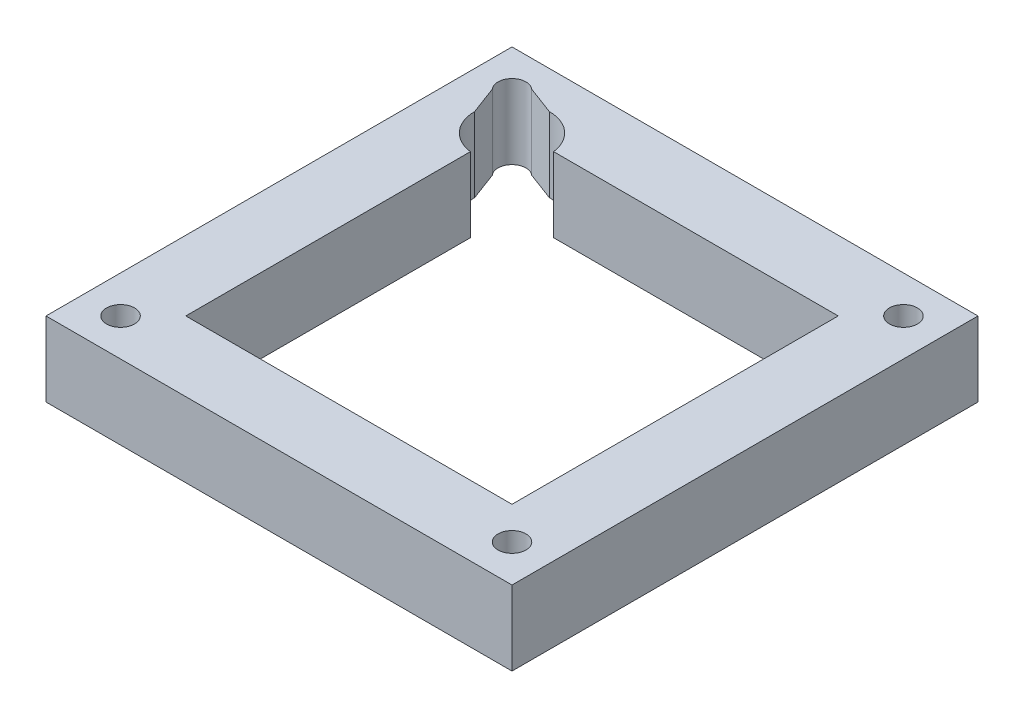
ISO-10303-21;
HEADER;
FILE_DESCRIPTION(('STEP AP214'),'2;1');
FILE_NAME('part.step','',(''),(''),'','','');
FILE_SCHEMA(('AUTOMOTIVE_DESIGN { 1 0 10303 214 1 1 1 1 }'));
ENDSEC;
DATA;
#1=APPLICATION_CONTEXT('core data for automotive mechanical design processes');
#2=APPLICATION_PROTOCOL_DEFINITION('international standard','automotive_design',2000,#1);
#3=PRODUCT_CONTEXT('',#1,'mechanical');
#4=PRODUCT('Part','Part','',(#3));
#5=PRODUCT_RELATED_PRODUCT_CATEGORY('part','',(#4));
#6=PRODUCT_DEFINITION_FORMATION('','',#4);
#7=PRODUCT_DEFINITION_CONTEXT('part definition',#1,'design');
#8=PRODUCT_DEFINITION('design','',#6,#7);
#9=PRODUCT_DEFINITION_SHAPE('','',#8);
#10=(LENGTH_UNIT() NAMED_UNIT(*) SI_UNIT(.MILLI.,.METRE.));
#11=(NAMED_UNIT(*) PLANE_ANGLE_UNIT() SI_UNIT($,.RADIAN.));
#12=(NAMED_UNIT(*) SI_UNIT($,.STERADIAN.) SOLID_ANGLE_UNIT());
#13=UNCERTAINTY_MEASURE_WITH_UNIT(LENGTH_MEASURE(1.E-05),#10,'distance_accuracy_value','');
#14=(GEOMETRIC_REPRESENTATION_CONTEXT(3) GLOBAL_UNCERTAINTY_ASSIGNED_CONTEXT((#13)) GLOBAL_UNIT_ASSIGNED_CONTEXT((#10,
#11,#12)) REPRESENTATION_CONTEXT('',''));
#15=CARTESIAN_POINT('',(0.,0.,0.));
#16=DIRECTION('',(0.,0.,1.));
#17=DIRECTION('',(1.,0.,0.));
#18=AXIS2_PLACEMENT_3D('',#15,#16,#17);
#19=CARTESIAN_POINT('',(0.,8.,25.));
#20=DIRECTION('',(0.,0.,-1.));
#21=DIRECTION('',(-1.,0.,0.));
#22=AXIS2_PLACEMENT_3D('',#19,#20,#21);
#23=PLANE('',#22);
#24=DIRECTION('',(1.,0.,0.));
#25=VECTOR('',#24,1.);
#26=CARTESIAN_POINT('',(0.,0.,25.));
#27=LINE('',#26,#25);
#28=CARTESIAN_POINT('',(-25.,0.,25.));
#29=VERTEX_POINT('',#28);
#30=CARTESIAN_POINT('',(25.,0.,25.));
#31=VERTEX_POINT('',#30);
#32=EDGE_CURVE('E226',#29,#31,#27,.T.);
#33=ORIENTED_EDGE('',*,*,#32,.T.);
#34=DIRECTION('',(0.,-1.,0.));
#35=VECTOR('',#34,1.);
#36=CARTESIAN_POINT('',(25.,8.,25.));
#37=LINE('',#36,#35);
#38=CARTESIAN_POINT('',(25.,8.,25.));
#39=VERTEX_POINT('',#38);
#40=EDGE_CURVE('E11',#39,#31,#37,.T.);
#41=ORIENTED_EDGE('',*,*,#40,.F.);
#42=DIRECTION('',(1.,0.,0.));
#43=VECTOR('',#42,1.);
#44=CARTESIAN_POINT('',(0.,8.,25.));
#45=LINE('',#44,#43);
#46=CARTESIAN_POINT('',(-25.,8.,25.));
#47=VERTEX_POINT('',#46);
#48=EDGE_CURVE('E160',#47,#39,#45,.T.);
#49=ORIENTED_EDGE('',*,*,#48,.F.);
#50=DIRECTION('',(0.,-1.,0.));
#51=VECTOR('',#50,1.);
#52=CARTESIAN_POINT('',(-25.,8.,25.));
#53=LINE('',#52,#51);
#54=EDGE_CURVE('E69',#47,#29,#53,.T.);
#55=ORIENTED_EDGE('',*,*,#54,.T.);
#56=EDGE_LOOP('',(#33,#41,#49,#55));
#57=FACE_BOUND('',#56,.T.);
#58=ADVANCED_FACE('F49',(#57),#23,.F.);
#59=CARTESIAN_POINT('',(25.,8.,0.));
#60=DIRECTION('',(-1.,0.,0.));
#61=DIRECTION('',(0.,0.,1.));
#62=AXIS2_PLACEMENT_3D('',#59,#60,#61);
#63=PLANE('',#62);
#64=DIRECTION('',(0.,0.,-1.));
#65=VECTOR('',#64,1.);
#66=CARTESIAN_POINT('',(25.,0.,0.));
#67=LINE('',#66,#65);
#68=CARTESIAN_POINT('',(25.,0.,-25.));
#69=VERTEX_POINT('',#68);
#70=EDGE_CURVE('E167',#31,#69,#67,.T.);
#71=ORIENTED_EDGE('',*,*,#70,.T.);
#72=DIRECTION('',(0.,-1.,0.));
#73=VECTOR('',#72,1.);
#74=CARTESIAN_POINT('',(25.,8.,-25.));
#75=LINE('',#74,#73);
#76=CARTESIAN_POINT('',(25.,8.,-25.));
#77=VERTEX_POINT('',#76);
#78=EDGE_CURVE('E60',#77,#69,#75,.T.);
#79=ORIENTED_EDGE('',*,*,#78,.F.);
#80=DIRECTION('',(0.,0.,-1.));
#81=VECTOR('',#80,1.);
#82=CARTESIAN_POINT('',(25.,8.,0.));
#83=LINE('',#82,#81);
#84=EDGE_CURVE('E153',#39,#77,#83,.T.);
#85=ORIENTED_EDGE('',*,*,#84,.F.);
#86=ORIENTED_EDGE('',*,*,#40,.T.);
#87=EDGE_LOOP('',(#71,#79,#85,#86));
#88=FACE_BOUND('',#87,.T.);
#89=ADVANCED_FACE('F166',(#88),#63,.F.);
#90=CARTESIAN_POINT('',(0.,8.,-25.));
#91=DIRECTION('',(0.,0.,-1.));
#92=DIRECTION('',(-1.,0.,0.));
#93=AXIS2_PLACEMENT_3D('',#90,#91,#92);
#94=PLANE('',#93);
#95=DIRECTION('',(1.,0.,0.));
#96=VECTOR('',#95,1.);
#97=CARTESIAN_POINT('',(0.,0.,-25.));
#98=LINE('',#97,#96);
#99=CARTESIAN_POINT('',(-25.,0.,-25.));
#100=VERTEX_POINT('',#99);
#101=EDGE_CURVE('E231',#100,#69,#98,.T.);
#102=ORIENTED_EDGE('',*,*,#101,.F.);
#103=DIRECTION('',(0.,-1.,0.));
#104=VECTOR('',#103,1.);
#105=CARTESIAN_POINT('',(-25.,8.,-25.));
#106=LINE('',#105,#104);
#107=CARTESIAN_POINT('',(-25.,8.,-25.));
#108=VERTEX_POINT('',#107);
#109=EDGE_CURVE('E110',#108,#100,#106,.T.);
#110=ORIENTED_EDGE('',*,*,#109,.F.);
#111=DIRECTION('',(1.,0.,0.));
#112=VECTOR('',#111,1.);
#113=CARTESIAN_POINT('',(0.,8.,-25.));
#114=LINE('',#113,#112);
#115=EDGE_CURVE('E159',#108,#77,#114,.T.);
#116=ORIENTED_EDGE('',*,*,#115,.T.);
#117=ORIENTED_EDGE('',*,*,#78,.T.);
#118=EDGE_LOOP('',(#102,#110,#116,#117));
#119=FACE_BOUND('',#118,.T.);
#120=ADVANCED_FACE('F172',(#119),#94,.T.);
#121=CARTESIAN_POINT('',(-17.,8.,-17.));
#122=DIRECTION('',(0.,-1.,0.));
#123=DIRECTION('',(0.,0.,-1.));
#124=AXIS2_PLACEMENT_3D('',#121,#122,#123);
#125=CYLINDRICAL_SURFACE('',#124,4.);
#126=CARTESIAN_POINT('',(-17.,0.,-17.));
#127=DIRECTION('',(0.,1.,0.));
#128=DIRECTION('',(0.,0.,1.));
#129=AXIS2_PLACEMENT_3D('',#126,#127,#128);
#130=CIRCLE('',#129,4.);
#131=CARTESIAN_POINT('',(-13.0313730334031,0.,-17.5));
#132=VERTEX_POINT('',#131);
#133=CARTESIAN_POINT('',(-17.,0.,-21.));
#134=VERTEX_POINT('',#133);
#135=EDGE_CURVE('E189',#132,#134,#130,.T.);
#136=ORIENTED_EDGE('',*,*,#135,.F.);
#137=DIRECTION('',(0.,-1.,0.));
#138=VECTOR('',#137,1.);
#139=CARTESIAN_POINT('',(-13.0313730334031,8.,-17.5));
#140=LINE('',#139,#138);
#141=CARTESIAN_POINT('',(-13.0313730334031,8.,-17.5));
#142=VERTEX_POINT('',#141);
#143=EDGE_CURVE('E53',#142,#132,#140,.T.);
#144=ORIENTED_EDGE('',*,*,#143,.F.);
#145=CARTESIAN_POINT('',(-17.,8.,-17.));
#146=DIRECTION('',(0.,1.,0.));
#147=DIRECTION('',(0.,0.,1.));
#148=AXIS2_PLACEMENT_3D('',#145,#146,#147);
#149=CIRCLE('',#148,4.);
#150=CARTESIAN_POINT('',(-17.,8.,-21.));
#151=VERTEX_POINT('',#150);
#152=EDGE_CURVE('E246',#142,#151,#149,.T.);
#153=ORIENTED_EDGE('',*,*,#152,.T.);
#154=DIRECTION('',(0.,-1.,0.));
#155=VECTOR('',#154,1.);
#156=CARTESIAN_POINT('',(-17.,8.,-21.));
#157=LINE('',#156,#155);
#158=EDGE_CURVE('E188',#151,#134,#157,.T.);
#159=ORIENTED_EDGE('',*,*,#158,.T.);
#160=EDGE_LOOP('',(#136,#144,#153,#159));
#161=FACE_BOUND('',#160,.T.);
#162=ADVANCED_FACE('F281',(#161),#125,.F.);
#163=CARTESIAN_POINT('',(0.,8.,-17.5));
#164=DIRECTION('',(0.,0.,1.));
#165=DIRECTION('',(1.,0.,0.));
#166=AXIS2_PLACEMENT_3D('',#163,#164,#165);
#167=PLANE('',#166);
#168=DIRECTION('',(-1.,0.,0.));
#169=VECTOR('',#168,1.);
#170=CARTESIAN_POINT('',(0.,0.,-17.5));
#171=LINE('',#170,#169);
#172=CARTESIAN_POINT('',(17.5,0.,-17.5));
#173=VERTEX_POINT('',#172);
#174=EDGE_CURVE('E193',#173,#132,#171,.T.);
#175=ORIENTED_EDGE('',*,*,#174,.F.);
#176=DIRECTION('',(0.,-1.,0.));
#177=VECTOR('',#176,1.);
#178=CARTESIAN_POINT('',(17.5,8.,-17.5));
#179=LINE('',#178,#177);
#180=CARTESIAN_POINT('',(17.5,8.,-17.5));
#181=VERTEX_POINT('',#180);
#182=EDGE_CURVE('E270',#181,#173,#179,.T.);
#183=ORIENTED_EDGE('',*,*,#182,.F.);
#184=DIRECTION('',(-1.,0.,0.));
#185=VECTOR('',#184,1.);
#186=CARTESIAN_POINT('',(0.,8.,-17.5));
#187=LINE('',#186,#185);
#188=EDGE_CURVE('E280',#181,#142,#187,.T.);
#189=ORIENTED_EDGE('',*,*,#188,.T.);
#190=ORIENTED_EDGE('',*,*,#143,.T.);
#191=EDGE_LOOP('',(#175,#183,#189,#190));
#192=FACE_BOUND('',#191,.T.);
#193=ADVANCED_FACE('F51',(#192),#167,.T.);
#194=CARTESIAN_POINT('',(17.5,8.,0.));
#195=DIRECTION('',(-1.,0.,0.));
#196=DIRECTION('',(0.,0.,1.));
#197=AXIS2_PLACEMENT_3D('',#194,#195,#196);
#198=PLANE('',#197);
#199=DIRECTION('',(0.,0.,-1.));
#200=VECTOR('',#199,1.);
#201=CARTESIAN_POINT('',(17.5,0.,0.));
#202=LINE('',#201,#200);
#203=CARTESIAN_POINT('',(17.5,0.,17.5));
#204=VERTEX_POINT('',#203);
#205=EDGE_CURVE('E198',#204,#173,#202,.T.);
#206=ORIENTED_EDGE('',*,*,#205,.F.);
#207=DIRECTION('',(0.,-1.,0.));
#208=VECTOR('',#207,1.);
#209=CARTESIAN_POINT('',(17.5,8.,17.5));
#210=LINE('',#209,#208);
#211=CARTESIAN_POINT('',(17.5,8.,17.5));
#212=VERTEX_POINT('',#211);
#213=EDGE_CURVE('E268',#212,#204,#210,.T.);
#214=ORIENTED_EDGE('',*,*,#213,.F.);
#215=DIRECTION('',(0.,0.,-1.));
#216=VECTOR('',#215,1.);
#217=CARTESIAN_POINT('',(17.5,8.,0.));
#218=LINE('',#217,#216);
#219=EDGE_CURVE('E291',#212,#181,#218,.T.);
#220=ORIENTED_EDGE('',*,*,#219,.T.);
#221=ORIENTED_EDGE('',*,*,#182,.T.);
#222=EDGE_LOOP('',(#206,#214,#220,#221));
#223=FACE_BOUND('',#222,.T.);
#224=ADVANCED_FACE('F289',(#223),#198,.T.);
#225=CARTESIAN_POINT('',(0.,8.,17.5));
#226=DIRECTION('',(0.,0.,-1.));
#227=DIRECTION('',(-1.,0.,0.));
#228=AXIS2_PLACEMENT_3D('',#225,#226,#227);
#229=PLANE('',#228);
#230=DIRECTION('',(1.,0.,0.));
#231=VECTOR('',#230,1.);
#232=CARTESIAN_POINT('',(0.,0.,17.5));
#233=LINE('',#232,#231);
#234=CARTESIAN_POINT('',(-17.5,0.,17.5));
#235=VERTEX_POINT('',#234);
#236=EDGE_CURVE('E202',#235,#204,#233,.T.);
#237=ORIENTED_EDGE('',*,*,#236,.F.);
#238=DIRECTION('',(0.,-1.,0.));
#239=VECTOR('',#238,1.);
#240=CARTESIAN_POINT('',(-17.5,8.,17.5));
#241=LINE('',#240,#239);
#242=CARTESIAN_POINT('',(-17.5,8.,17.5));
#243=VERTEX_POINT('',#242);
#244=EDGE_CURVE('E265',#243,#235,#241,.T.);
#245=ORIENTED_EDGE('',*,*,#244,.F.);
#246=DIRECTION('',(1.,0.,0.));
#247=VECTOR('',#246,1.);
#248=CARTESIAN_POINT('',(0.,8.,17.5));
#249=LINE('',#248,#247);
#250=EDGE_CURVE('E297',#243,#212,#249,.T.);
#251=ORIENTED_EDGE('',*,*,#250,.T.);
#252=ORIENTED_EDGE('',*,*,#213,.T.);
#253=EDGE_LOOP('',(#237,#245,#251,#252));
#254=FACE_BOUND('',#253,.T.);
#255=ADVANCED_FACE('F300',(#254),#229,.T.);
#256=CARTESIAN_POINT('',(-17.5,8.,0.));
#257=DIRECTION('',(-1.,0.,0.));
#258=DIRECTION('',(0.,0.,1.));
#259=AXIS2_PLACEMENT_3D('',#256,#257,#258);
#260=PLANE('',#259);
#261=DIRECTION('',(0.,0.,-1.));
#262=VECTOR('',#261,1.);
#263=CARTESIAN_POINT('',(-17.5,0.,0.));
#264=LINE('',#263,#262);
#265=CARTESIAN_POINT('',(-17.5,0.,-13.0313730334031));
#266=VERTEX_POINT('',#265);
#267=EDGE_CURVE('E206',#235,#266,#264,.T.);
#268=ORIENTED_EDGE('',*,*,#267,.T.);
#269=DIRECTION('',(0.,-1.,0.));
#270=VECTOR('',#269,1.);
#271=CARTESIAN_POINT('',(-17.5,8.,-13.0313730334031));
#272=LINE('',#271,#270);
#273=CARTESIAN_POINT('',(-17.5,8.,-13.0313730334031));
#274=VERTEX_POINT('',#273);
#275=EDGE_CURVE('E262',#274,#266,#272,.T.);
#276=ORIENTED_EDGE('',*,*,#275,.F.);
#277=DIRECTION('',(0.,0.,-1.));
#278=VECTOR('',#277,1.);
#279=CARTESIAN_POINT('',(-17.5,8.,0.));
#280=LINE('',#279,#278);
#281=EDGE_CURVE('E303',#243,#274,#280,.T.);
#282=ORIENTED_EDGE('',*,*,#281,.F.);
#283=ORIENTED_EDGE('',*,*,#244,.T.);
#284=EDGE_LOOP('',(#268,#276,#282,#283));
#285=FACE_BOUND('',#284,.T.);
#286=ADVANCED_FACE('F349',(#285),#260,.F.);
#287=CARTESIAN_POINT('',(-21.,0.,-17.));
#288=VERTEX_POINT('',#287);
#289=EDGE_CURVE('E194',#288,#266,#130,.T.);
#290=ORIENTED_EDGE('',*,*,#289,.F.);
#291=DIRECTION('',(0.,-1.,0.));
#292=VECTOR('',#291,1.);
#293=CARTESIAN_POINT('',(-21.,8.,-17.));
#294=LINE('',#293,#292);
#295=CARTESIAN_POINT('',(-21.,8.,-17.));
#296=VERTEX_POINT('',#295);
#297=EDGE_CURVE('E259',#296,#288,#294,.T.);
#298=ORIENTED_EDGE('',*,*,#297,.F.);
#299=EDGE_CURVE('E306',#296,#274,#149,.T.);
#300=ORIENTED_EDGE('',*,*,#299,.T.);
#301=ORIENTED_EDGE('',*,*,#275,.T.);
#302=EDGE_LOOP('',(#290,#298,#300,#301));
#303=FACE_BOUND('',#302,.T.);
#304=ADVANCED_FACE('F346',(#303),#125,.F.);
#305=CARTESIAN_POINT('',(-12.8219178082192,8.,4.80821917808219));
#306=DIRECTION('',(0.936329177569045,0.,-0.351123441588392));
#307=DIRECTION('',(-0.351123441588392,0.,-0.936329177569045));
#308=AXIS2_PLACEMENT_3D('',#305,#306,#307);
#309=PLANE('',#308);
#310=DIRECTION('',(0.351123441588392,0.,0.936329177569044));
#311=VECTOR('',#310,1.);
#312=CARTESIAN_POINT('',(-12.8219178082192,0.,4.80821917808219));
#313=LINE('',#312,#311);
#314=CARTESIAN_POINT('',(-22.1301369863014,0.,-20.013698630137));
#315=VERTEX_POINT('',#314);
#316=EDGE_CURVE('E210',#315,#288,#313,.T.);
#317=ORIENTED_EDGE('',*,*,#316,.F.);
#318=DIRECTION('',(0.,-1.,0.));
#319=VECTOR('',#318,1.);
#320=CARTESIAN_POINT('',(-22.1301369863014,8.,-20.013698630137));
#321=LINE('',#320,#319);
#322=CARTESIAN_POINT('',(-22.1301369863014,8.,-20.013698630137));
#323=VERTEX_POINT('',#322);
#324=EDGE_CURVE('E256',#323,#315,#321,.T.);
#325=ORIENTED_EDGE('',*,*,#324,.F.);
#326=DIRECTION('',(0.351123441588392,0.,0.936329177569044));
#327=VECTOR('',#326,1.);
#328=CARTESIAN_POINT('',(-12.8219178082192,8.,4.80821917808219));
#329=LINE('',#328,#327);
#330=EDGE_CURVE('E310',#323,#296,#329,.T.);
#331=ORIENTED_EDGE('',*,*,#330,.T.);
#332=ORIENTED_EDGE('',*,*,#297,.T.);
#333=EDGE_LOOP('',(#317,#325,#331,#332));
#334=FACE_BOUND('',#333,.T.);
#335=ADVANCED_FACE('F342',(#334),#309,.T.);
#336=CARTESIAN_POINT('',(-21.,8.,-21.));
#337=DIRECTION('',(0.,-1.,0.));
#338=DIRECTION('',(0.,0.,-1.));
#339=AXIS2_PLACEMENT_3D('',#336,#337,#338);
#340=CYLINDRICAL_SURFACE('',#339,1.5);
#341=CARTESIAN_POINT('',(-21.,0.,-21.));
#342=DIRECTION('',(0.,1.,0.));
#343=DIRECTION('',(0.,0.,1.));
#344=AXIS2_PLACEMENT_3D('',#341,#342,#343);
#345=CIRCLE('',#344,1.5);
#346=CARTESIAN_POINT('',(-20.013698630137,0.,-22.1301369863014));
#347=VERTEX_POINT('',#346);
#348=EDGE_CURVE('E214',#347,#315,#345,.T.);
#349=ORIENTED_EDGE('',*,*,#348,.F.);
#350=DIRECTION('',(0.,-1.,0.));
#351=VECTOR('',#350,1.);
#352=CARTESIAN_POINT('',(-20.013698630137,8.,-22.1301369863014));
#353=LINE('',#352,#351);
#354=CARTESIAN_POINT('',(-20.013698630137,8.,-22.1301369863014));
#355=VERTEX_POINT('',#354);
#356=EDGE_CURVE('E253',#355,#347,#353,.T.);
#357=ORIENTED_EDGE('',*,*,#356,.F.);
#358=CARTESIAN_POINT('',(-21.,8.,-21.));
#359=DIRECTION('',(0.,1.,0.));
#360=DIRECTION('',(0.,0.,1.));
#361=AXIS2_PLACEMENT_3D('',#358,#359,#360);
#362=CIRCLE('',#361,1.5);
#363=EDGE_CURVE('E314',#355,#323,#362,.T.);
#364=ORIENTED_EDGE('',*,*,#363,.T.);
#365=ORIENTED_EDGE('',*,*,#324,.T.);
#366=EDGE_LOOP('',(#349,#357,#364,#365));
#367=FACE_BOUND('',#366,.T.);
#368=ADVANCED_FACE('F339',(#367),#340,.F.);
#369=CARTESIAN_POINT('',(21.,8.,21.));
#370=DIRECTION('',(0.,-1.,0.));
#371=DIRECTION('',(0.,0.,-1.));
#372=AXIS2_PLACEMENT_3D('',#369,#370,#371);
#373=CYLINDRICAL_SURFACE('',#372,1.5);
#374=CARTESIAN_POINT('',(21.,8.,21.));
#375=DIRECTION('',(0.,1.,0.));
#376=DIRECTION('',(0.,0.,1.));
#377=AXIS2_PLACEMENT_3D('',#374,#375,#376);
#378=CIRCLE('',#377,1.5);
#379=CARTESIAN_POINT('',(21.,8.,22.5));
#380=VERTEX_POINT('',#379);
#381=EDGE_CURVE('E177',#380,#380,#378,.T.);
#382=ORIENTED_EDGE('',*,*,#381,.T.);
#383=EDGE_LOOP('',(#382));
#384=FACE_BOUND('',#383,.T.);
#385=CARTESIAN_POINT('',(21.,0.,21.));
#386=DIRECTION('',(0.,1.,0.));
#387=DIRECTION('',(0.,0.,1.));
#388=AXIS2_PLACEMENT_3D('',#385,#386,#387);
#389=CIRCLE('',#388,1.5);
#390=CARTESIAN_POINT('',(21.,0.,22.5));
#391=VERTEX_POINT('',#390);
#392=EDGE_CURVE('E238',#391,#391,#389,.T.);
#393=ORIENTED_EDGE('',*,*,#392,.F.);
#394=EDGE_LOOP('',(#393));
#395=FACE_BOUND('',#394,.T.);
#396=ADVANCED_FACE('F376',(#384,#395),#373,.F.);
#397=CARTESIAN_POINT('',(-25.,8.,0.));
#398=DIRECTION('',(-1.,0.,0.));
#399=DIRECTION('',(0.,0.,1.));
#400=AXIS2_PLACEMENT_3D('',#397,#398,#399);
#401=PLANE('',#400);
#402=DIRECTION('',(0.,0.,-1.));
#403=VECTOR('',#402,1.);
#404=CARTESIAN_POINT('',(-25.,0.,0.));
#405=LINE('',#404,#403);
#406=EDGE_CURVE('E234',#29,#100,#405,.T.);
#407=ORIENTED_EDGE('',*,*,#406,.F.);
#408=ORIENTED_EDGE('',*,*,#54,.F.);
#409=DIRECTION('',(0.,0.,-1.));
#410=VECTOR('',#409,1.);
#411=CARTESIAN_POINT('',(-25.,8.,0.));
#412=LINE('',#411,#410);
#413=EDGE_CURVE('E174',#47,#108,#412,.T.);
#414=ORIENTED_EDGE('',*,*,#413,.T.);
#415=ORIENTED_EDGE('',*,*,#109,.T.);
#416=EDGE_LOOP('',(#407,#408,#414,#415));
#417=FACE_BOUND('',#416,.T.);
#418=ADVANCED_FACE('F369',(#417),#401,.T.);
#419=CARTESIAN_POINT('',(21.,8.,-21.));
#420=DIRECTION('',(0.,-1.,0.));
#421=DIRECTION('',(0.,0.,-1.));
#422=AXIS2_PLACEMENT_3D('',#419,#420,#421);
#423=CYLINDRICAL_SURFACE('',#422,1.5);
#424=CARTESIAN_POINT('',(21.,8.,-21.));
#425=DIRECTION('',(0.,1.,0.));
#426=DIRECTION('',(0.,0.,1.));
#427=AXIS2_PLACEMENT_3D('',#424,#425,#426);
#428=CIRCLE('',#427,1.5);
#429=CARTESIAN_POINT('',(21.,8.,-19.5));
#430=VERTEX_POINT('',#429);
#431=EDGE_CURVE('E321',#430,#430,#428,.F.);
#432=ORIENTED_EDGE('',*,*,#431,.F.);
#433=EDGE_LOOP('',(#432));
#434=FACE_BOUND('',#433,.T.);
#435=CARTESIAN_POINT('',(21.,0.,-21.));
#436=DIRECTION('',(0.,1.,0.));
#437=DIRECTION('',(0.,0.,1.));
#438=AXIS2_PLACEMENT_3D('',#435,#436,#437);
#439=CIRCLE('',#438,1.5);
#440=CARTESIAN_POINT('',(21.,0.,-19.5));
#441=VERTEX_POINT('',#440);
#442=EDGE_CURVE('E222',#441,#441,#439,.F.);
#443=ORIENTED_EDGE('',*,*,#442,.T.);
#444=EDGE_LOOP('',(#443));
#445=FACE_BOUND('',#444,.T.);
#446=ADVANCED_FACE('F366',(#434,#445),#423,.F.);
#447=CARTESIAN_POINT('',(4.80821917808219,8.,-12.8219178082192));
#448=DIRECTION('',(0.351123441588392,0.,-0.936329177569045));
#449=DIRECTION('',(-0.936329177569045,0.,-0.351123441588392));
#450=AXIS2_PLACEMENT_3D('',#447,#448,#449);
#451=PLANE('',#450);
#452=DIRECTION('',(0.936329177569044,0.,0.351123441588392));
#453=VECTOR('',#452,1.);
#454=CARTESIAN_POINT('',(4.80821917808219,0.,-12.8219178082192));
#455=LINE('',#454,#453);
#456=EDGE_CURVE('E218',#347,#134,#455,.T.);
#457=ORIENTED_EDGE('',*,*,#456,.T.);
#458=ORIENTED_EDGE('',*,*,#158,.F.);
#459=DIRECTION('',(0.936329177569044,0.,0.351123441588392));
#460=VECTOR('',#459,1.);
#461=CARTESIAN_POINT('',(4.80821917808219,8.,-12.8219178082192));
#462=LINE('',#461,#460);
#463=EDGE_CURVE('E318',#355,#151,#462,.T.);
#464=ORIENTED_EDGE('',*,*,#463,.F.);
#465=ORIENTED_EDGE('',*,*,#356,.T.);
#466=EDGE_LOOP('',(#457,#458,#464,#465));
#467=FACE_BOUND('',#466,.T.);
#468=ADVANCED_FACE('F336',(#467),#451,.F.);
#469=CARTESIAN_POINT('',(-21.,8.,21.));
#470=DIRECTION('',(0.,-1.,0.));
#471=DIRECTION('',(0.,0.,-1.));
#472=AXIS2_PLACEMENT_3D('',#469,#470,#471);
#473=CYLINDRICAL_SURFACE('',#472,1.5);
#474=CARTESIAN_POINT('',(-21.,8.,21.));
#475=DIRECTION('',(0.,1.,0.));
#476=DIRECTION('',(0.,0.,1.));
#477=AXIS2_PLACEMENT_3D('',#474,#475,#476);
#478=CIRCLE('',#477,1.5);
#479=CARTESIAN_POINT('',(-21.,8.,22.5));
#480=VERTEX_POINT('',#479);
#481=EDGE_CURVE('E184',#480,#480,#478,.F.);
#482=ORIENTED_EDGE('',*,*,#481,.F.);
#483=EDGE_LOOP('',(#482));
#484=FACE_BOUND('',#483,.T.);
#485=CARTESIAN_POINT('',(-21.,0.,21.));
#486=DIRECTION('',(0.,1.,0.));
#487=DIRECTION('',(0.,0.,1.));
#488=AXIS2_PLACEMENT_3D('',#485,#486,#487);
#489=CIRCLE('',#488,1.5);
#490=CARTESIAN_POINT('',(-21.,0.,22.5));
#491=VERTEX_POINT('',#490);
#492=EDGE_CURVE('E242',#491,#491,#489,.F.);
#493=ORIENTED_EDGE('',*,*,#492,.T.);
#494=EDGE_LOOP('',(#493));
#495=FACE_BOUND('',#494,.T.);
#496=ADVANCED_FACE('F373',(#484,#495),#473,.F.);
#497=CARTESIAN_POINT('',(0.,8.,0.));
#498=DIRECTION('',(0.,1.,0.));
#499=DIRECTION('',(0.,0.,1.));
#500=AXIS2_PLACEMENT_3D('',#497,#498,#499);
#501=PLANE('',#500);
#502=ORIENTED_EDGE('',*,*,#152,.F.);
#503=ORIENTED_EDGE('',*,*,#188,.F.);
#504=ORIENTED_EDGE('',*,*,#219,.F.);
#505=ORIENTED_EDGE('',*,*,#250,.F.);
#506=ORIENTED_EDGE('',*,*,#281,.T.);
#507=ORIENTED_EDGE('',*,*,#299,.F.);
#508=ORIENTED_EDGE('',*,*,#330,.F.);
#509=ORIENTED_EDGE('',*,*,#363,.F.);
#510=ORIENTED_EDGE('',*,*,#463,.T.);
#511=EDGE_LOOP('',(#502,#503,#504,#505,#506,#507,#508,#509,#510));
#512=FACE_BOUND('',#511,.T.);
#513=ORIENTED_EDGE('',*,*,#431,.T.);
#514=EDGE_LOOP('',(#513));
#515=FACE_BOUND('',#514,.T.);
#516=ORIENTED_EDGE('',*,*,#48,.T.);
#517=ORIENTED_EDGE('',*,*,#84,.T.);
#518=ORIENTED_EDGE('',*,*,#115,.F.);
#519=ORIENTED_EDGE('',*,*,#413,.F.);
#520=EDGE_LOOP('',(#516,#517,#518,#519));
#521=FACE_BOUND('',#520,.T.);
#522=ORIENTED_EDGE('',*,*,#381,.F.);
#523=EDGE_LOOP('',(#522));
#524=FACE_BOUND('',#523,.T.);
#525=ORIENTED_EDGE('',*,*,#481,.T.);
#526=EDGE_LOOP('',(#525));
#527=FACE_BOUND('',#526,.T.);
#528=ADVANCED_FACE('F155',(#512,#515,#521,#524,#527),#501,.T.);
#529=CARTESIAN_POINT('',(0.,0.,0.));
#530=DIRECTION('',(0.,1.,0.));
#531=DIRECTION('',(0.,0.,1.));
#532=AXIS2_PLACEMENT_3D('',#529,#530,#531);
#533=PLANE('',#532);
#534=ORIENTED_EDGE('',*,*,#135,.T.);
#535=ORIENTED_EDGE('',*,*,#456,.F.);
#536=ORIENTED_EDGE('',*,*,#348,.T.);
#537=ORIENTED_EDGE('',*,*,#316,.T.);
#538=ORIENTED_EDGE('',*,*,#289,.T.);
#539=ORIENTED_EDGE('',*,*,#267,.F.);
#540=ORIENTED_EDGE('',*,*,#236,.T.);
#541=ORIENTED_EDGE('',*,*,#205,.T.);
#542=ORIENTED_EDGE('',*,*,#174,.T.);
#543=EDGE_LOOP('',(#534,#535,#536,#537,#538,#539,#540,#541,#542));
#544=FACE_BOUND('',#543,.T.);
#545=ORIENTED_EDGE('',*,*,#442,.F.);
#546=EDGE_LOOP('',(#545));
#547=FACE_BOUND('',#546,.T.);
#548=ORIENTED_EDGE('',*,*,#32,.F.);
#549=ORIENTED_EDGE('',*,*,#406,.T.);
#550=ORIENTED_EDGE('',*,*,#101,.T.);
#551=ORIENTED_EDGE('',*,*,#70,.F.);
#552=EDGE_LOOP('',(#548,#549,#550,#551));
#553=FACE_BOUND('',#552,.T.);
#554=ORIENTED_EDGE('',*,*,#392,.T.);
#555=EDGE_LOOP('',(#554));
#556=FACE_BOUND('',#555,.T.);
#557=ORIENTED_EDGE('',*,*,#492,.F.);
#558=EDGE_LOOP('',(#557));
#559=FACE_BOUND('',#558,.T.);
#560=ADVANCED_FACE('F285',(#544,#547,#553,#556,#559),#533,.F.);
#561=CLOSED_SHELL('',(#58,#89,#120,#162,#193,#224,#255,#286,#304,#335,#368,#396,#418,#446,#468,
#496,#528,#560));
#562=MANIFOLD_SOLID_BREP('B2',#561);
#563=ADVANCED_BREP_SHAPE_REPRESENTATION('',(#18,#562),#14);
#564=SHAPE_DEFINITION_REPRESENTATION(#9,#563);
ENDSEC;
END-ISO-10303-21;
